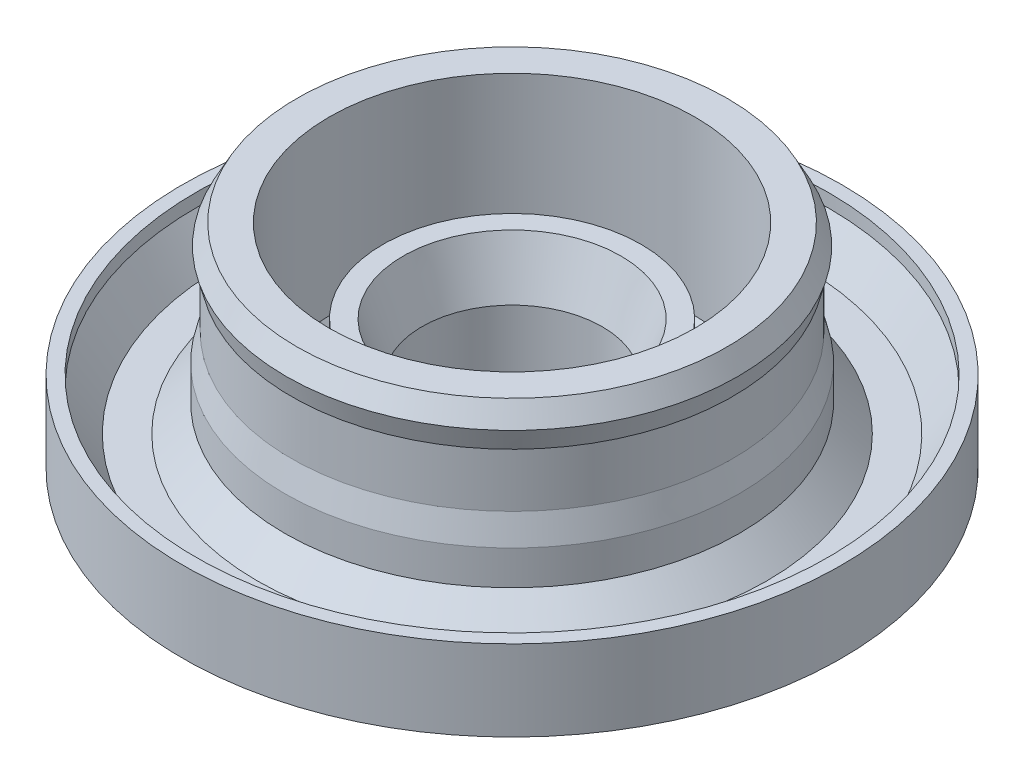
ISO-10303-21;
HEADER;
FILE_DESCRIPTION(('STEP AP214'),'2;1');
FILE_NAME('part.step','',(''),(''),'','','');
FILE_SCHEMA(('AUTOMOTIVE_DESIGN { 1 0 10303 214 1 1 1 1 }'));
ENDSEC;
DATA;
#1=APPLICATION_CONTEXT('core data for automotive mechanical design processes');
#2=APPLICATION_PROTOCOL_DEFINITION('international standard','automotive_design',2000,#1);
#3=PRODUCT_CONTEXT('',#1,'mechanical');
#4=PRODUCT('Part','Part','',(#3));
#5=PRODUCT_RELATED_PRODUCT_CATEGORY('part','',(#4));
#6=PRODUCT_DEFINITION_FORMATION('','',#4);
#7=PRODUCT_DEFINITION_CONTEXT('part definition',#1,'design');
#8=PRODUCT_DEFINITION('design','',#6,#7);
#9=PRODUCT_DEFINITION_SHAPE('','',#8);
#10=(LENGTH_UNIT() NAMED_UNIT(*) SI_UNIT(.MILLI.,.METRE.));
#11=(NAMED_UNIT(*) PLANE_ANGLE_UNIT() SI_UNIT($,.RADIAN.));
#12=(NAMED_UNIT(*) SI_UNIT($,.STERADIAN.) SOLID_ANGLE_UNIT());
#13=UNCERTAINTY_MEASURE_WITH_UNIT(LENGTH_MEASURE(1.E-05),#10,'distance_accuracy_value','');
#14=(GEOMETRIC_REPRESENTATION_CONTEXT(3) GLOBAL_UNCERTAINTY_ASSIGNED_CONTEXT((#13)) GLOBAL_UNIT_ASSIGNED_CONTEXT((#10,
#11,#12)) REPRESENTATION_CONTEXT('',''));
#15=CARTESIAN_POINT('',(0.,0.,0.));
#16=DIRECTION('',(0.,0.,1.));
#17=DIRECTION('',(1.,0.,0.));
#18=AXIS2_PLACEMENT_3D('',#15,#16,#17);
#19=CARTESIAN_POINT('',(-6.8,4.5,0.));
#20=DIRECTION('',(0.,1.,0.));
#21=DIRECTION('',(0.,0.,1.));
#22=AXIS2_PLACEMENT_3D('',#19,#20,#21);
#23=PLANE('',#22);
#24=CARTESIAN_POINT('',(0.,4.5,0.));
#25=DIRECTION('',(0.,1.,0.));
#26=DIRECTION('',(0.,0.,1.));
#27=AXIS2_PLACEMENT_3D('',#24,#25,#26);
#28=CIRCLE('',#27,4.8);
#29=CARTESIAN_POINT('',(0.,4.5,4.8));
#30=VERTEX_POINT('',#29);
#31=EDGE_CURVE('E67',#30,#30,#28,.F.);
#32=ORIENTED_EDGE('',*,*,#31,.T.);
#33=EDGE_LOOP('',(#32));
#34=FACE_BOUND('',#33,.T.);
#35=CARTESIAN_POINT('',(0.,4.5,0.));
#36=DIRECTION('',(0.,-1.,0.));
#37=DIRECTION('',(0.,0.,-1.));
#38=AXIS2_PLACEMENT_3D('',#35,#36,#37);
#39=CIRCLE('',#38,6.);
#40=CARTESIAN_POINT('',(0.,4.5,-6.));
#41=VERTEX_POINT('',#40);
#42=EDGE_CURVE('E126',#41,#41,#39,.T.);
#43=ORIENTED_EDGE('',*,*,#42,.F.);
#44=EDGE_LOOP('',(#43));
#45=FACE_BOUND('',#44,.T.);
#46=ADVANCED_FACE('F37',(#34,#45),#23,.T.);
#47=CARTESIAN_POINT('',(0.,0.,0.));
#48=DIRECTION('',(0.,-1.,0.));
#49=DIRECTION('',(0.,0.,-1.));
#50=AXIS2_PLACEMENT_3D('',#47,#48,#49);
#51=CYLINDRICAL_SURFACE('',#50,6.79980664538812);
#52=CARTESIAN_POINT('',(0.,12.,0.));
#53=DIRECTION('',(0.,-1.,0.));
#54=DIRECTION('',(0.,0.,-1.));
#55=AXIS2_PLACEMENT_3D('',#52,#53,#54);
#56=CIRCLE('',#55,6.79980664538812);
#57=CARTESIAN_POINT('',(0.,12.,-6.79980664538812));
#58=VERTEX_POINT('',#57);
#59=EDGE_CURVE('E102',#58,#58,#56,.T.);
#60=ORIENTED_EDGE('',*,*,#59,.F.);
#61=EDGE_LOOP('',(#60));
#62=FACE_BOUND('',#61,.T.);
#63=CARTESIAN_POINT('',(0.,5.6,0.));
#64=DIRECTION('',(0.,1.,0.));
#65=DIRECTION('',(0.,0.,1.));
#66=AXIS2_PLACEMENT_3D('',#63,#64,#65);
#67=CIRCLE('',#66,6.79980664538812);
#68=CARTESIAN_POINT('',(0.,5.6,6.79980664538812));
#69=VERTEX_POINT('',#68);
#70=EDGE_CURVE('E57',#69,#69,#67,.T.);
#71=ORIENTED_EDGE('',*,*,#70,.F.);
#72=EDGE_LOOP('',(#71));
#73=FACE_BOUND('',#72,.T.);
#74=ADVANCED_FACE('F133',(#62,#73),#51,.F.);
#75=CARTESIAN_POINT('',(-4.8,3.74441937071962,0.));
#76=DIRECTION('',(0.,1.,0.));
#77=DIRECTION('',(0.,0.,1.));
#78=AXIS2_PLACEMENT_3D('',#75,#76,#77);
#79=PLANE('',#78);
#80=CARTESIAN_POINT('',(0.,3.74441937071962,0.));
#81=DIRECTION('',(0.,1.,0.));
#82=DIRECTION('',(0.,0.,1.));
#83=AXIS2_PLACEMENT_3D('',#80,#81,#82);
#84=CIRCLE('',#83,4.45);
#85=CARTESIAN_POINT('',(0.,3.74441937071962,4.45));
#86=VERTEX_POINT('',#85);
#87=EDGE_CURVE('E63',#86,#86,#84,.F.);
#88=ORIENTED_EDGE('',*,*,#87,.T.);
#89=EDGE_LOOP('',(#88));
#90=FACE_BOUND('',#89,.T.);
#91=CARTESIAN_POINT('',(0.,3.74441937071962,0.));
#92=DIRECTION('',(0.,1.,0.));
#93=DIRECTION('',(0.,0.,1.));
#94=AXIS2_PLACEMENT_3D('',#91,#92,#93);
#95=CIRCLE('',#94,3.85);
#96=CARTESIAN_POINT('',(0.,3.74441937071962,3.85));
#97=VERTEX_POINT('',#96);
#98=EDGE_CURVE('E60',#97,#97,#95,.F.);
#99=ORIENTED_EDGE('',*,*,#98,.F.);
#100=EDGE_LOOP('',(#99));
#101=FACE_BOUND('',#100,.T.);
#102=ADVANCED_FACE('F139',(#90,#101),#79,.F.);
#103=CARTESIAN_POINT('',(0.,0.,0.));
#104=DIRECTION('',(0.,-1.,0.));
#105=DIRECTION('',(0.,0.,-1.));
#106=AXIS2_PLACEMENT_3D('',#103,#104,#105);
#107=CYLINDRICAL_SURFACE('',#106,4.45);
#108=CARTESIAN_POINT('',(0.,0.,0.));
#109=DIRECTION('',(0.,-1.,0.));
#110=DIRECTION('',(0.,0.,-1.));
#111=AXIS2_PLACEMENT_3D('',#108,#109,#110);
#112=CIRCLE('',#111,4.45);
#113=CARTESIAN_POINT('',(0.,0.,-4.45));
#114=VERTEX_POINT('',#113);
#115=EDGE_CURVE('E79',#114,#114,#112,.T.);
#116=ORIENTED_EDGE('',*,*,#115,.T.);
#117=EDGE_LOOP('',(#116));
#118=FACE_BOUND('',#117,.T.);
#119=ORIENTED_EDGE('',*,*,#87,.F.);
#120=EDGE_LOOP('',(#119));
#121=FACE_BOUND('',#120,.T.);
#122=ADVANCED_FACE('F171',(#118,#121),#107,.F.);
#123=CARTESIAN_POINT('',(0.,0.,0.));
#124=DIRECTION('',(0.,-1.,0.));
#125=DIRECTION('',(0.,0.,-1.));
#126=AXIS2_PLACEMENT_3D('',#123,#124,#125);
#127=CYLINDRICAL_SURFACE('',#126,12.25);
#128=CARTESIAN_POINT('',(0.,4.1,0.));
#129=DIRECTION('',(0.,-1.,0.));
#130=DIRECTION('',(0.,0.,-1.));
#131=AXIS2_PLACEMENT_3D('',#128,#129,#130);
#132=CIRCLE('',#131,12.25);
#133=CARTESIAN_POINT('',(0.,4.1,-12.25));
#134=VERTEX_POINT('',#133);
#135=EDGE_CURVE('E75',#134,#134,#132,.T.);
#136=ORIENTED_EDGE('',*,*,#135,.F.);
#137=EDGE_LOOP('',(#136));
#138=FACE_BOUND('',#137,.T.);
#139=CARTESIAN_POINT('',(0.,7.1,0.));
#140=DIRECTION('',(0.,-1.,0.));
#141=DIRECTION('',(0.,0.,-1.));
#142=AXIS2_PLACEMENT_3D('',#139,#140,#141);
#143=CIRCLE('',#142,12.25);
#144=CARTESIAN_POINT('',(0.,7.1,-12.25));
#145=VERTEX_POINT('',#144);
#146=EDGE_CURVE('E66',#145,#145,#143,.T.);
#147=ORIENTED_EDGE('',*,*,#146,.T.);
#148=EDGE_LOOP('',(#147));
#149=FACE_BOUND('',#148,.T.);
#150=ADVANCED_FACE('F174',(#138,#149),#127,.T.);
#151=CARTESIAN_POINT('',(-12.25,7.1,0.));
#152=DIRECTION('',(0.,-1.,0.));
#153=DIRECTION('',(0.,0.,-1.));
#154=AXIS2_PLACEMENT_3D('',#151,#152,#153);
#155=PLANE('',#154);
#156=CARTESIAN_POINT('',(0.,7.1,0.));
#157=DIRECTION('',(0.,-1.,0.));
#158=DIRECTION('',(0.,0.,-1.));
#159=AXIS2_PLACEMENT_3D('',#156,#157,#158);
#160=CIRCLE('',#159,11.75);
#161=CARTESIAN_POINT('',(0.,7.1,-11.75));
#162=VERTEX_POINT('',#161);
#163=EDGE_CURVE('E72',#162,#162,#160,.F.);
#164=ORIENTED_EDGE('',*,*,#163,.F.);
#165=EDGE_LOOP('',(#164));
#166=FACE_BOUND('',#165,.T.);
#167=ORIENTED_EDGE('',*,*,#146,.F.);
#168=EDGE_LOOP('',(#167));
#169=FACE_BOUND('',#168,.T.);
#170=ADVANCED_FACE('F169',(#166,#169),#155,.F.);
#171=CARTESIAN_POINT('',(-4.45,0.,0.));
#172=DIRECTION('',(0.,1.,0.));
#173=DIRECTION('',(0.,0.,1.));
#174=AXIS2_PLACEMENT_3D('',#171,#172,#173);
#175=PLANE('',#174);
#176=CARTESIAN_POINT('',(0.,0.,0.));
#177=DIRECTION('',(0.,1.,0.));
#178=DIRECTION('',(0.,0.,1.));
#179=AXIS2_PLACEMENT_3D('',#176,#177,#178);
#180=CIRCLE('',#179,5.5);
#181=CARTESIAN_POINT('',(0.,0.,5.5));
#182=VERTEX_POINT('',#181);
#183=EDGE_CURVE('E52',#182,#182,#180,.F.);
#184=ORIENTED_EDGE('',*,*,#183,.T.);
#185=EDGE_LOOP('',(#184));
#186=FACE_BOUND('',#185,.T.);
#187=ORIENTED_EDGE('',*,*,#115,.F.);
#188=EDGE_LOOP('',(#187));
#189=FACE_BOUND('',#188,.T.);
#190=ADVANCED_FACE('F165',(#186,#189),#175,.F.);
#191=CARTESIAN_POINT('',(0.,0.,0.));
#192=DIRECTION('',(0.,-1.,0.));
#193=DIRECTION('',(0.,0.,-1.));
#194=AXIS2_PLACEMENT_3D('',#191,#192,#193);
#195=CYLINDRICAL_SURFACE('',#194,6.);
#196=CARTESIAN_POINT('',(0.,0.5,0.));
#197=DIRECTION('',(0.,1.,0.));
#198=DIRECTION('',(0.,0.,1.));
#199=AXIS2_PLACEMENT_3D('',#196,#197,#198);
#200=CIRCLE('',#199,6.);
#201=CARTESIAN_POINT('',(0.,0.5,6.));
#202=VERTEX_POINT('',#201);
#203=EDGE_CURVE('E48',#202,#202,#200,.T.);
#204=ORIENTED_EDGE('',*,*,#203,.T.);
#205=EDGE_LOOP('',(#204));
#206=FACE_BOUND('',#205,.T.);
#207=CARTESIAN_POINT('',(0.,4.1,0.));
#208=DIRECTION('',(0.,-1.,0.));
#209=DIRECTION('',(0.,0.,-1.));
#210=AXIS2_PLACEMENT_3D('',#207,#208,#209);
#211=CIRCLE('',#210,6.);
#212=CARTESIAN_POINT('',(0.,4.1,-6.));
#213=VERTEX_POINT('',#212);
#214=EDGE_CURVE('E82',#213,#213,#211,.T.);
#215=ORIENTED_EDGE('',*,*,#214,.T.);
#216=EDGE_LOOP('',(#215));
#217=FACE_BOUND('',#216,.T.);
#218=ADVANCED_FACE('F161',(#206,#217),#195,.T.);
#219=CARTESIAN_POINT('',(-6.,4.1,0.));
#220=DIRECTION('',(0.,1.,0.));
#221=DIRECTION('',(0.,0.,1.));
#222=AXIS2_PLACEMENT_3D('',#219,#220,#221);
#223=PLANE('',#222);
#224=ORIENTED_EDGE('',*,*,#214,.F.);
#225=EDGE_LOOP('',(#224));
#226=FACE_BOUND('',#225,.T.);
#227=ORIENTED_EDGE('',*,*,#135,.T.);
#228=EDGE_LOOP('',(#227));
#229=FACE_BOUND('',#228,.T.);
#230=ADVANCED_FACE('F157',(#226,#229),#223,.F.);
#231=CARTESIAN_POINT('',(0.,4.5,0.));
#232=DIRECTION('',(0.,-1.,0.));
#233=DIRECTION('',(0.,0.,-1.));
#234=AXIS2_PLACEMENT_3D('',#231,#232,#233);
#235=CYLINDRICAL_SURFACE('',#234,11.75);
#236=CARTESIAN_POINT('',(0.,6.6,0.));
#237=DIRECTION('',(0.,-1.,0.));
#238=DIRECTION('',(0.,0.,-1.));
#239=AXIS2_PLACEMENT_3D('',#236,#237,#238);
#240=CIRCLE('',#239,11.75);
#241=CARTESIAN_POINT('',(0.,6.6,-11.75));
#242=VERTEX_POINT('',#241);
#243=EDGE_CURVE('E76',#242,#242,#240,.T.);
#244=ORIENTED_EDGE('',*,*,#243,.T.);
#245=EDGE_LOOP('',(#244));
#246=FACE_BOUND('',#245,.T.);
#247=ORIENTED_EDGE('',*,*,#163,.T.);
#248=EDGE_LOOP('',(#247));
#249=FACE_BOUND('',#248,.T.);
#250=ADVANCED_FACE('F153',(#246,#249),#235,.F.);
#251=CARTESIAN_POINT('',(0.,6.6,0.));
#252=DIRECTION('',(0.,1.,0.));
#253=DIRECTION('',(0.,0.,1.));
#254=AXIS2_PLACEMENT_3D('',#251,#252,#253);
#255=CONICAL_SURFACE('',#254,11.75,0.61086523819801);
#256=CARTESIAN_POINT('',(0.,5.2,0.));
#257=DIRECTION('',(0.,-1.,0.));
#258=DIRECTION('',(0.,0.,-1.));
#259=AXIS2_PLACEMENT_3D('',#256,#257,#258);
#260=CIRCLE('',#259,10.7697094465064);
#261=CARTESIAN_POINT('',(0.,5.2,-10.7697094465064));
#262=VERTEX_POINT('',#261);
#263=EDGE_CURVE('E70',#262,#262,#260,.T.);
#264=ORIENTED_EDGE('',*,*,#263,.T.);
#265=EDGE_LOOP('',(#264));
#266=FACE_BOUND('',#265,.T.);
#267=ORIENTED_EDGE('',*,*,#243,.F.);
#268=EDGE_LOOP('',(#267));
#269=FACE_BOUND('',#268,.T.);
#270=ADVANCED_FACE('F149',(#266,#269),#255,.F.);
#271=CARTESIAN_POINT('',(-10.7697094465064,5.2,0.));
#272=DIRECTION('',(0.,1.,0.));
#273=DIRECTION('',(0.,0.,1.));
#274=AXIS2_PLACEMENT_3D('',#271,#272,#273);
#275=PLANE('',#274);
#276=CARTESIAN_POINT('',(0.,5.2,0.));
#277=DIRECTION('',(0.,-1.,0.));
#278=DIRECTION('',(0.,0.,-1.));
#279=AXIS2_PLACEMENT_3D('',#276,#277,#278);
#280=CIRCLE('',#279,9.46980664538812);
#281=CARTESIAN_POINT('',(0.,5.2,-9.46980664538812));
#282=VERTEX_POINT('',#281);
#283=EDGE_CURVE('E105',#282,#282,#280,.T.);
#284=ORIENTED_EDGE('',*,*,#283,.T.);
#285=EDGE_LOOP('',(#284));
#286=FACE_BOUND('',#285,.T.);
#287=ORIENTED_EDGE('',*,*,#263,.F.);
#288=EDGE_LOOP('',(#287));
#289=FACE_BOUND('',#288,.T.);
#290=ADVANCED_FACE('F146',(#286,#289),#275,.T.);
#291=CARTESIAN_POINT('',(-4.05,8.9,0.));
#292=DIRECTION('',(0.,-1.,0.));
#293=DIRECTION('',(0.,0.,-1.));
#294=AXIS2_PLACEMENT_3D('',#291,#292,#293);
#295=PLANE('',#294);
#296=CARTESIAN_POINT('',(0.,8.9,0.));
#297=DIRECTION('',(0.,-1.,0.));
#298=DIRECTION('',(0.,0.,-1.));
#299=AXIS2_PLACEMENT_3D('',#296,#297,#298);
#300=CIRCLE('',#299,4.8);
#301=CARTESIAN_POINT('',(0.,8.9,-4.8));
#302=VERTEX_POINT('',#301);
#303=EDGE_CURVE('E71',#302,#302,#300,.T.);
#304=ORIENTED_EDGE('',*,*,#303,.F.);
#305=EDGE_LOOP('',(#304));
#306=FACE_BOUND('',#305,.T.);
#307=CARTESIAN_POINT('',(0.,8.9,0.));
#308=DIRECTION('',(0.,-1.,0.));
#309=DIRECTION('',(0.,0.,-1.));
#310=AXIS2_PLACEMENT_3D('',#307,#308,#309);
#311=CIRCLE('',#310,4.05);
#312=CARTESIAN_POINT('',(0.,8.9,-4.05));
#313=VERTEX_POINT('',#312);
#314=EDGE_CURVE('E96',#313,#313,#311,.T.);
#315=ORIENTED_EDGE('',*,*,#314,.T.);
#316=EDGE_LOOP('',(#315));
#317=FACE_BOUND('',#316,.T.);
#318=ADVANCED_FACE('F144',(#306,#317),#295,.F.);
#319=CARTESIAN_POINT('',(0.,0.,0.));
#320=DIRECTION('',(0.,-1.,0.));
#321=DIRECTION('',(0.,0.,-1.));
#322=AXIS2_PLACEMENT_3D('',#319,#320,#321);
#323=CYLINDRICAL_SURFACE('',#322,4.8);
#324=ORIENTED_EDGE('',*,*,#31,.F.);
#325=EDGE_LOOP('',(#324));
#326=FACE_BOUND('',#325,.T.);
#327=ORIENTED_EDGE('',*,*,#303,.T.);
#328=EDGE_LOOP('',(#327));
#329=FACE_BOUND('',#328,.T.);
#330=ADVANCED_FACE('F225',(#326,#329),#323,.T.);
#331=CARTESIAN_POINT('',(0.,0.,0.));
#332=DIRECTION('',(0.,-1.,0.));
#333=DIRECTION('',(0.,0.,-1.));
#334=AXIS2_PLACEMENT_3D('',#331,#332,#333);
#335=CYLINDRICAL_SURFACE('',#334,3.35);
#336=CARTESIAN_POINT('',(0.,6.97676580638177,0.));
#337=DIRECTION('',(0.,-1.,0.));
#338=DIRECTION('',(0.,0.,-1.));
#339=AXIS2_PLACEMENT_3D('',#336,#337,#338);
#340=CIRCLE('',#339,3.35);
#341=CARTESIAN_POINT('',(0.,6.97676580638177,-3.35));
#342=VERTEX_POINT('',#341);
#343=EDGE_CURVE('E93',#342,#342,#340,.T.);
#344=ORIENTED_EDGE('',*,*,#343,.F.);
#345=EDGE_LOOP('',(#344));
#346=FACE_BOUND('',#345,.T.);
#347=CARTESIAN_POINT('',(0.,1.64441937071962,0.));
#348=DIRECTION('',(0.,-1.,0.));
#349=DIRECTION('',(0.,0.,-1.));
#350=AXIS2_PLACEMENT_3D('',#347,#348,#349);
#351=CIRCLE('',#350,3.35);
#352=CARTESIAN_POINT('',(0.,1.64441937071962,-3.35));
#353=VERTEX_POINT('',#352);
#354=EDGE_CURVE('E99',#353,#353,#351,.T.);
#355=ORIENTED_EDGE('',*,*,#354,.T.);
#356=EDGE_LOOP('',(#355));
#357=FACE_BOUND('',#356,.T.);
#358=ADVANCED_FACE('F222',(#346,#357),#335,.F.);
#359=CARTESIAN_POINT('',(0.,6.97676580638177,0.));
#360=DIRECTION('',(0.,1.,0.));
#361=DIRECTION('',(0.,0.,1.));
#362=AXIS2_PLACEMENT_3D('',#359,#360,#361);
#363=CONICAL_SURFACE('',#362,3.35,0.349065850398867);
#364=ORIENTED_EDGE('',*,*,#314,.F.);
#365=EDGE_LOOP('',(#364));
#366=FACE_BOUND('',#365,.T.);
#367=ORIENTED_EDGE('',*,*,#343,.T.);
#368=EDGE_LOOP('',(#367));
#369=FACE_BOUND('',#368,.T.);
#370=ADVANCED_FACE('F217',(#366,#369),#363,.F.);
#371=CARTESIAN_POINT('',(0.,1.64441937071962,0.));
#372=DIRECTION('',(0.,-1.,0.));
#373=DIRECTION('',(0.,0.,-1.));
#374=AXIS2_PLACEMENT_3D('',#371,#372,#373);
#375=PLANE('',#374);
#376=CARTESIAN_POINT('',(0.,1.64441937071962,0.));
#377=DIRECTION('',(0.,-1.,0.));
#378=DIRECTION('',(0.,0.,-1.));
#379=AXIS2_PLACEMENT_3D('',#376,#377,#378);
#380=CIRCLE('',#379,3.65);
#381=CARTESIAN_POINT('',(0.,1.64441937071962,-3.65));
#382=VERTEX_POINT('',#381);
#383=EDGE_CURVE('E44',#382,#382,#380,.T.);
#384=ORIENTED_EDGE('',*,*,#383,.T.);
#385=EDGE_LOOP('',(#384));
#386=FACE_BOUND('',#385,.T.);
#387=ORIENTED_EDGE('',*,*,#354,.F.);
#388=EDGE_LOOP('',(#387));
#389=FACE_BOUND('',#388,.T.);
#390=ADVANCED_FACE('F208',(#386,#389),#375,.T.);
#391=CARTESIAN_POINT('',(0.,1.64441937071962,0.));
#392=DIRECTION('',(0.,1.,0.));
#393=DIRECTION('',(0.,0.,1.));
#394=AXIS2_PLACEMENT_3D('',#391,#392,#393);
#395=CYLINDRICAL_SURFACE('',#394,3.85);
#396=CARTESIAN_POINT('',(0.,1.84441937071962,0.));
#397=DIRECTION('',(0.,-1.,0.));
#398=DIRECTION('',(0.,0.,-1.));
#399=AXIS2_PLACEMENT_3D('',#396,#397,#398);
#400=CIRCLE('',#399,3.85);
#401=CARTESIAN_POINT('',(0.,1.84441937071962,-3.85));
#402=VERTEX_POINT('',#401);
#403=EDGE_CURVE('E10',#402,#402,#400,.F.);
#404=ORIENTED_EDGE('',*,*,#403,.T.);
#405=EDGE_LOOP('',(#404));
#406=FACE_BOUND('',#405,.T.);
#407=ORIENTED_EDGE('',*,*,#98,.T.);
#408=EDGE_LOOP('',(#407));
#409=FACE_BOUND('',#408,.T.);
#410=ADVANCED_FACE('F205',(#406,#409),#395,.T.);
#411=CARTESIAN_POINT('',(-7.99980664538812,12.,0.));
#412=DIRECTION('',(0.,-1.,0.));
#413=DIRECTION('',(0.,0.,-1.));
#414=AXIS2_PLACEMENT_3D('',#411,#412,#413);
#415=PLANE('',#414);
#416=CARTESIAN_POINT('',(0.,12.,0.));
#417=DIRECTION('',(0.,-1.,0.));
#418=DIRECTION('',(0.,0.,-1.));
#419=AXIS2_PLACEMENT_3D('',#416,#417,#418);
#420=CIRCLE('',#419,7.99980664538812);
#421=CARTESIAN_POINT('',(0.,12.,-7.99980664538812));
#422=VERTEX_POINT('',#421);
#423=EDGE_CURVE('E123',#422,#422,#420,.T.);
#424=ORIENTED_EDGE('',*,*,#423,.F.);
#425=EDGE_LOOP('',(#424));
#426=FACE_BOUND('',#425,.T.);
#427=ORIENTED_EDGE('',*,*,#59,.T.);
#428=EDGE_LOOP('',(#427));
#429=FACE_BOUND('',#428,.T.);
#430=ADVANCED_FACE('F207',(#426,#429),#415,.F.);
#431=CARTESIAN_POINT('',(0.,6.21980664538811,0.));
#432=DIRECTION('',(0.,-1.,0.));
#433=DIRECTION('',(0.,0.,-1.));
#434=AXIS2_PLACEMENT_3D('',#431,#432,#433);
#435=CONICAL_SURFACE('',#434,8.45,0.785398163397453);
#436=ORIENTED_EDGE('',*,*,#283,.F.);
#437=EDGE_LOOP('',(#436));
#438=FACE_BOUND('',#437,.T.);
#439=CARTESIAN_POINT('',(0.,6.21980664538811,0.));
#440=DIRECTION('',(0.,-1.,0.));
#441=DIRECTION('',(0.,0.,-1.));
#442=AXIS2_PLACEMENT_3D('',#439,#440,#441);
#443=CIRCLE('',#442,8.45);
#444=CARTESIAN_POINT('',(0.,6.21980664538811,-8.45));
#445=VERTEX_POINT('',#444);
#446=EDGE_CURVE('E108',#445,#445,#443,.T.);
#447=ORIENTED_EDGE('',*,*,#446,.T.);
#448=EDGE_LOOP('',(#447));
#449=FACE_BOUND('',#448,.T.);
#450=ADVANCED_FACE('F214',(#438,#449),#435,.T.);
#451=CARTESIAN_POINT('',(0.,0.,0.));
#452=DIRECTION('',(0.,-1.,0.));
#453=DIRECTION('',(0.,0.,-1.));
#454=AXIS2_PLACEMENT_3D('',#451,#452,#453);
#455=CYLINDRICAL_SURFACE('',#454,8.45);
#456=ORIENTED_EDGE('',*,*,#446,.F.);
#457=EDGE_LOOP('',(#456));
#458=FACE_BOUND('',#457,.T.);
#459=CARTESIAN_POINT('',(0.,7.5,0.));
#460=DIRECTION('',(0.,-1.,0.));
#461=DIRECTION('',(0.,0.,-1.));
#462=AXIS2_PLACEMENT_3D('',#459,#460,#461);
#463=CIRCLE('',#462,8.45);
#464=CARTESIAN_POINT('',(0.,7.5,-8.45));
#465=VERTEX_POINT('',#464);
#466=EDGE_CURVE('E111',#465,#465,#463,.T.);
#467=ORIENTED_EDGE('',*,*,#466,.T.);
#468=EDGE_LOOP('',(#467));
#469=FACE_BOUND('',#468,.T.);
#470=ADVANCED_FACE('F333',(#458,#469),#455,.T.);
#471=CARTESIAN_POINT('',(0.,8.5,0.));
#472=DIRECTION('',(0.,-1.,0.));
#473=DIRECTION('',(0.,0.,-1.));
#474=AXIS2_PLACEMENT_3D('',#471,#472,#473);
#475=CONICAL_SURFACE('',#474,8.2,0.244978663126866);
#476=ORIENTED_EDGE('',*,*,#466,.F.);
#477=EDGE_LOOP('',(#476));
#478=FACE_BOUND('',#477,.T.);
#479=CARTESIAN_POINT('',(0.,8.5,0.));
#480=DIRECTION('',(0.,-1.,0.));
#481=DIRECTION('',(0.,0.,-1.));
#482=AXIS2_PLACEMENT_3D('',#479,#480,#481);
#483=CIRCLE('',#482,8.2);
#484=CARTESIAN_POINT('',(0.,8.5,-8.2));
#485=VERTEX_POINT('',#484);
#486=EDGE_CURVE('E114',#485,#485,#483,.T.);
#487=ORIENTED_EDGE('',*,*,#486,.T.);
#488=EDGE_LOOP('',(#487));
#489=FACE_BOUND('',#488,.T.);
#490=ADVANCED_FACE('F325',(#478,#489),#475,.T.);
#491=CARTESIAN_POINT('',(0.,0.,0.));
#492=DIRECTION('',(0.,-1.,0.));
#493=DIRECTION('',(0.,0.,-1.));
#494=AXIS2_PLACEMENT_3D('',#491,#492,#493);
#495=CYLINDRICAL_SURFACE('',#494,8.2);
#496=ORIENTED_EDGE('',*,*,#486,.F.);
#497=EDGE_LOOP('',(#496));
#498=FACE_BOUND('',#497,.T.);
#499=CARTESIAN_POINT('',(0.,10.5,0.));
#500=DIRECTION('',(0.,-1.,0.));
#501=DIRECTION('',(0.,0.,-1.));
#502=AXIS2_PLACEMENT_3D('',#499,#500,#501);
#503=CIRCLE('',#502,8.2);
#504=CARTESIAN_POINT('',(0.,10.5,-8.2));
#505=VERTEX_POINT('',#504);
#506=EDGE_CURVE('E117',#505,#505,#503,.T.);
#507=ORIENTED_EDGE('',*,*,#506,.T.);
#508=EDGE_LOOP('',(#507));
#509=FACE_BOUND('',#508,.T.);
#510=ADVANCED_FACE('F317',(#498,#509),#495,.T.);
#511=CARTESIAN_POINT('',(0.,11.25,0.));
#512=DIRECTION('',(0.,1.,0.));
#513=DIRECTION('',(0.,0.,1.));
#514=AXIS2_PLACEMENT_3D('',#511,#512,#513);
#515=CONICAL_SURFACE('',#514,8.40096189432334,0.261799387799148);
#516=ORIENTED_EDGE('',*,*,#506,.F.);
#517=EDGE_LOOP('',(#516));
#518=FACE_BOUND('',#517,.T.);
#519=CARTESIAN_POINT('',(0.,11.25,0.));
#520=DIRECTION('',(0.,-1.,0.));
#521=DIRECTION('',(0.,0.,-1.));
#522=AXIS2_PLACEMENT_3D('',#519,#520,#521);
#523=CIRCLE('',#522,8.40096189432334);
#524=CARTESIAN_POINT('',(0.,11.25,-8.40096189432334));
#525=VERTEX_POINT('',#524);
#526=EDGE_CURVE('E120',#525,#525,#523,.T.);
#527=ORIENTED_EDGE('',*,*,#526,.T.);
#528=EDGE_LOOP('',(#527));
#529=FACE_BOUND('',#528,.T.);
#530=ADVANCED_FACE('F310',(#518,#529),#515,.T.);
#531=CARTESIAN_POINT('',(0.,12.,0.));
#532=DIRECTION('',(0.,-1.,0.));
#533=DIRECTION('',(0.,0.,-1.));
#534=AXIS2_PLACEMENT_3D('',#531,#532,#533);
#535=CONICAL_SURFACE('',#534,7.99980664538812,0.491155779515811);
#536=ORIENTED_EDGE('',*,*,#526,.F.);
#537=EDGE_LOOP('',(#536));
#538=FACE_BOUND('',#537,.T.);
#539=ORIENTED_EDGE('',*,*,#423,.T.);
#540=EDGE_LOOP('',(#539));
#541=FACE_BOUND('',#540,.T.);
#542=ADVANCED_FACE('F189',(#538,#541),#535,.T.);
#543=CARTESIAN_POINT('',(0.,4.5,0.));
#544=DIRECTION('',(0.,1.,0.));
#545=DIRECTION('',(0.,0.,1.));
#546=AXIS2_PLACEMENT_3D('',#543,#544,#545);
#547=CONICAL_SURFACE('',#546,6.,0.628681309195307);
#548=ORIENTED_EDGE('',*,*,#70,.T.);
#549=EDGE_LOOP('',(#548));
#550=FACE_BOUND('',#549,.T.);
#551=ORIENTED_EDGE('',*,*,#42,.T.);
#552=EDGE_LOOP('',(#551));
#553=FACE_BOUND('',#552,.T.);
#554=ADVANCED_FACE('F130',(#550,#553),#547,.F.);
#555=CARTESIAN_POINT('',(0.,0.5,0.));
#556=DIRECTION('',(0.,1.,0.));
#557=DIRECTION('',(0.,0.,1.));
#558=AXIS2_PLACEMENT_3D('',#555,#556,#557);
#559=TOROIDAL_SURFACE('',#558,5.5,0.5);
#560=ORIENTED_EDGE('',*,*,#203,.F.);
#561=EDGE_LOOP('',(#560));
#562=FACE_BOUND('',#561,.T.);
#563=ORIENTED_EDGE('',*,*,#183,.F.);
#564=EDGE_LOOP('',(#563));
#565=FACE_BOUND('',#564,.T.);
#566=ADVANCED_FACE('F181',(#562,#565),#559,.T.);
#567=CARTESIAN_POINT('',(0.,1.84441937071962,0.));
#568=DIRECTION('',(0.,-1.,0.));
#569=DIRECTION('',(0.,0.,-1.));
#570=AXIS2_PLACEMENT_3D('',#567,#568,#569);
#571=TOROIDAL_SURFACE('',#570,3.65,0.2);
#572=ORIENTED_EDGE('',*,*,#403,.F.);
#573=EDGE_LOOP('',(#572));
#574=FACE_BOUND('',#573,.T.);
#575=ORIENTED_EDGE('',*,*,#383,.F.);
#576=EDGE_LOOP('',(#575));
#577=FACE_BOUND('',#576,.T.);
#578=ADVANCED_FACE('F39',(#574,#577),#571,.T.);
#579=CLOSED_SHELL('',(#46,#74,#102,#122,#150,#170,#190,#218,#230,#250,#270,#290,#318,#330,#358,
#370,#390,#410,#430,#450,#470,#490,#510,#530,#542,#554,#566,#578));
#580=MANIFOLD_SOLID_BREP('B2',#579);
#581=ADVANCED_BREP_SHAPE_REPRESENTATION('',(#18,#580),#14);
#582=SHAPE_DEFINITION_REPRESENTATION(#9,#581);
ENDSEC;
END-ISO-10303-21;
